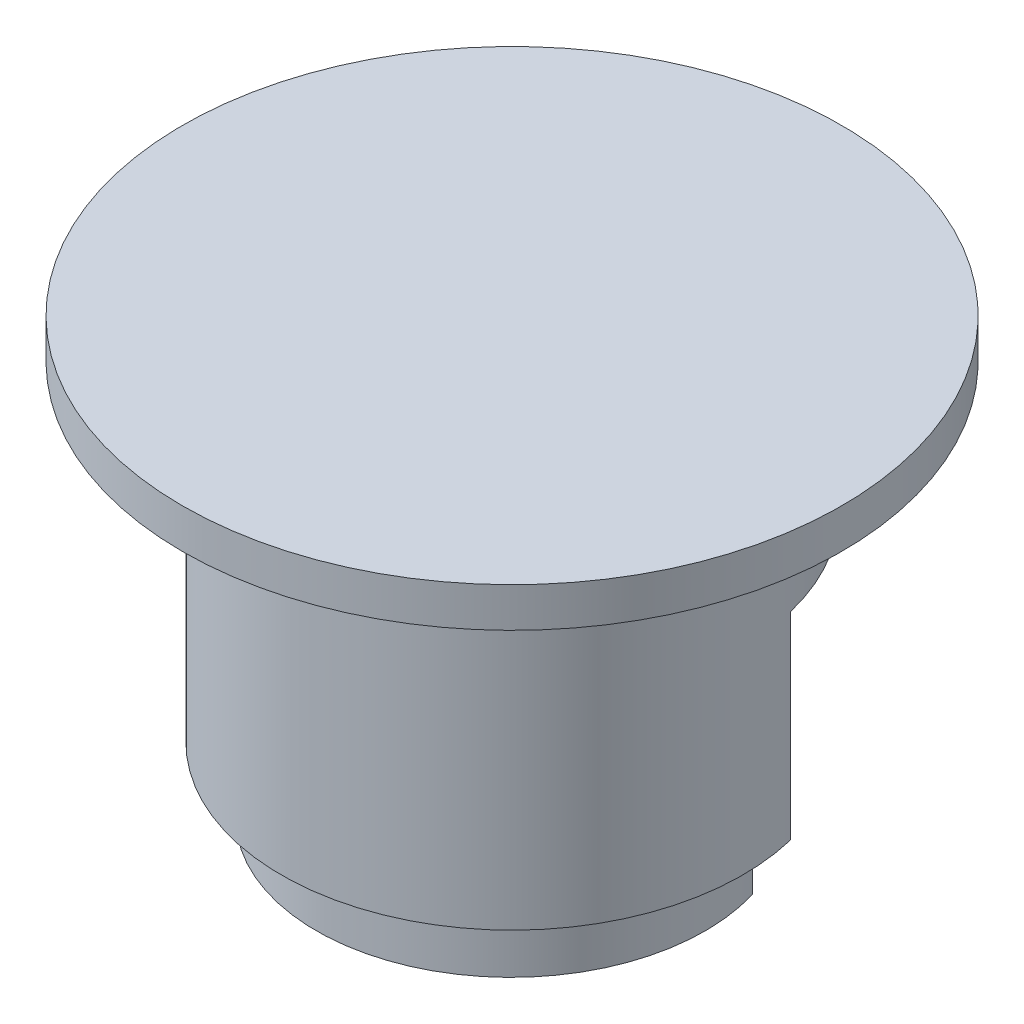
ISO-10303-21;
HEADER;
FILE_DESCRIPTION(('STEP AP214'),'2;1');
FILE_NAME('part.step','',(''),(''),'','','');
FILE_SCHEMA(('AUTOMOTIVE_DESIGN { 1 0 10303 214 1 1 1 1 }'));
ENDSEC;
DATA;
#1=APPLICATION_CONTEXT('core data for automotive mechanical design processes');
#2=APPLICATION_PROTOCOL_DEFINITION('international standard','automotive_design',2000,#1);
#3=PRODUCT_CONTEXT('',#1,'mechanical');
#4=PRODUCT('Part','Part','',(#3));
#5=PRODUCT_RELATED_PRODUCT_CATEGORY('part','',(#4));
#6=PRODUCT_DEFINITION_FORMATION('','',#4);
#7=PRODUCT_DEFINITION_CONTEXT('part definition',#1,'design');
#8=PRODUCT_DEFINITION('design','',#6,#7);
#9=PRODUCT_DEFINITION_SHAPE('','',#8);
#10=(LENGTH_UNIT() NAMED_UNIT(*) SI_UNIT(.MILLI.,.METRE.));
#11=(NAMED_UNIT(*) PLANE_ANGLE_UNIT() SI_UNIT($,.RADIAN.));
#12=(NAMED_UNIT(*) SI_UNIT($,.STERADIAN.) SOLID_ANGLE_UNIT());
#13=UNCERTAINTY_MEASURE_WITH_UNIT(LENGTH_MEASURE(1.E-05),#10,'distance_accuracy_value','');
#14=(GEOMETRIC_REPRESENTATION_CONTEXT(3) GLOBAL_UNCERTAINTY_ASSIGNED_CONTEXT((#13)) GLOBAL_UNIT_ASSIGNED_CONTEXT((#10,
#11,#12)) REPRESENTATION_CONTEXT('',''));
#15=CARTESIAN_POINT('',(0.,0.,0.));
#16=DIRECTION('',(0.,0.,1.));
#17=DIRECTION('',(1.,0.,0.));
#18=AXIS2_PLACEMENT_3D('',#15,#16,#17);
#19=CARTESIAN_POINT('',(0.,-60.,0.));
#20=DIRECTION('',(0.,-1.,0.));
#21=DIRECTION('',(0.,0.,-1.));
#22=AXIS2_PLACEMENT_3D('',#19,#20,#21);
#23=PLANE('',#22);
#24=DIRECTION('',(-1.,0.,0.));
#25=VECTOR('',#24,1.);
#26=CARTESIAN_POINT('',(0.,-60.,-8.20728450569601));
#27=LINE('',#26,#25);
#28=CARTESIAN_POINT('',(28.2813036881661,-60.,-8.20728450569601));
#29=VERTEX_POINT('',#28);
#30=CARTESIAN_POINT('',(6.,-60.,-8.20728450569601));
#31=VERTEX_POINT('',#30);
#32=EDGE_CURVE('E253',#29,#31,#27,.T.);
#33=ORIENTED_EDGE('',*,*,#32,.F.);
#34=CARTESIAN_POINT('',(0.,-60.,0.184250615944176));
#35=DIRECTION('',(0.,-1.,0.));
#36=DIRECTION('',(0.,0.,-1.));
#37=AXIS2_PLACEMENT_3D('',#34,#35,#36);
#38=CIRCLE('',#37,29.5);
#39=CARTESIAN_POINT('',(-28.2813036881661,-60.,-8.20728450569601));
#40=VERTEX_POINT('',#39);
#41=EDGE_CURVE('E189',#29,#40,#38,.T.);
#42=ORIENTED_EDGE('',*,*,#41,.T.);
#43=CARTESIAN_POINT('',(-6.,-60.,-8.20728450569601));
#44=VERTEX_POINT('',#43);
#45=EDGE_CURVE('E247',#44,#40,#27,.T.);
#46=ORIENTED_EDGE('',*,*,#45,.F.);
#47=DIRECTION('',(0.,0.,-1.));
#48=VECTOR('',#47,1.);
#49=CARTESIAN_POINT('',(-6.,-60.,0.));
#50=LINE('',#49,#48);
#51=CARTESIAN_POINT('',(-6.,-60.,-3.41877994011952));
#52=VERTEX_POINT('',#51);
#53=EDGE_CURVE('E232',#52,#44,#50,.T.);
#54=ORIENTED_EDGE('',*,*,#53,.F.);
#55=DIRECTION('',(-1.,0.,0.));
#56=VECTOR('',#55,1.);
#57=CARTESIAN_POINT('',(0.,-60.,-3.41877994011952));
#58=LINE('',#57,#56);
#59=CARTESIAN_POINT('',(-24.4594751937757,-60.,-3.41877994011952));
#60=VERTEX_POINT('',#59);
#61=EDGE_CURVE('E220',#52,#60,#58,.T.);
#62=ORIENTED_EDGE('',*,*,#61,.T.);
#63=CARTESIAN_POINT('',(-24.4594751937757,-60.,-1.41877994011952));
#64=DIRECTION('',(0.,-1.,0.));
#65=DIRECTION('',(0.,0.,-1.));
#66=AXIS2_PLACEMENT_3D('',#63,#64,#65);
#67=CIRCLE('',#66,2.);
#68=CARTESIAN_POINT('',(-26.2188474638346,-60.,-2.36988940561112));
#69=VERTEX_POINT('',#68);
#70=EDGE_CURVE('E315',#60,#69,#67,.F.);
#71=ORIENTED_EDGE('',*,*,#70,.T.);
#72=DIRECTION('',(-0.475554732745801,0.,0.87968613502946));
#73=VECTOR('',#72,1.);
#74=CARTESIAN_POINT('',(-21.2808116444844,-60.,-11.5043198832133));
#75=LINE('',#74,#73);
#76=CARTESIAN_POINT('',(-27.2545278621544,-60.,-0.454076936532669));
#77=VERTEX_POINT('',#76);
#78=EDGE_CURVE('E267',#69,#77,#75,.T.);
#79=ORIENTED_EDGE('',*,*,#78,.T.);
#80=CARTESIAN_POINT('',(-25.4951555920955,-60.,0.497032528958935));
#81=DIRECTION('',(0.,-1.,0.));
#82=DIRECTION('',(0.,0.,-1.));
#83=AXIS2_PLACEMENT_3D('',#80,#81,#82);
#84=CIRCLE('',#83,2.);
#85=CARTESIAN_POINT('',(-27.4947756385343,-60.,0.536015472406694));
#86=VERTEX_POINT('',#85);
#87=EDGE_CURVE('E317',#77,#86,#84,.F.);
#88=ORIENTED_EDGE('',*,*,#87,.T.);
#89=CARTESIAN_POINT('',(0.,-60.,0.));
#90=DIRECTION('',(0.,-1.,0.));
#91=DIRECTION('',(0.,0.,-1.));
#92=AXIS2_PLACEMENT_3D('',#89,#90,#91);
#93=CIRCLE('',#92,27.5);
#94=CARTESIAN_POINT('',(27.4963333127981,-60.,0.449059407551334));
#95=VERTEX_POINT('',#94);
#96=EDGE_CURVE('E264',#95,#86,#93,.T.);
#97=ORIENTED_EDGE('',*,*,#96,.F.);
#98=CARTESIAN_POINT('',(25.4965999809582,-60.,0.416400541547601));
#99=DIRECTION('',(0.,-1.,0.));
#100=DIRECTION('',(0.,0.,-1.));
#101=AXIS2_PLACEMENT_3D('',#98,#99,#100);
#102=CIRCLE('',#101,2.);
#103=CARTESIAN_POINT('',(27.3245113363701,-60.,-0.395227499340749));
#104=VERTEX_POINT('',#103);
#105=EDGE_CURVE('E12',#95,#104,#102,.F.);
#106=ORIENTED_EDGE('',*,*,#105,.T.);
#107=DIRECTION('',(-0.405814020444177,0.,-0.913955677705945));
#108=VECTOR('',#107,1.);
#109=CARTESIAN_POINT('',(22.9711619723007,-60.,-10.1996407721349));
#110=LINE('',#109,#108);
#111=CARTESIAN_POINT('',(26.5096556626515,-60.,-2.23040798100787));
#112=VERTEX_POINT('',#111);
#113=EDGE_CURVE('E265',#104,#112,#110,.T.);
#114=ORIENTED_EDGE('',*,*,#113,.T.);
#115=CARTESIAN_POINT('',(24.6817443072396,-60.,-1.41877994011952));
#116=DIRECTION('',(0.,-1.,0.));
#117=DIRECTION('',(0.,0.,-1.));
#118=AXIS2_PLACEMENT_3D('',#115,#116,#117);
#119=CIRCLE('',#118,2.);
#120=CARTESIAN_POINT('',(24.6817443072396,-60.,-3.41877994011952));
#121=VERTEX_POINT('',#120);
#122=EDGE_CURVE('E48',#112,#121,#119,.F.);
#123=ORIENTED_EDGE('',*,*,#122,.T.);
#124=CARTESIAN_POINT('',(6.,-60.,-3.41877994011952));
#125=VERTEX_POINT('',#124);
#126=EDGE_CURVE('E217',#121,#125,#58,.T.);
#127=ORIENTED_EDGE('',*,*,#126,.T.);
#128=DIRECTION('',(0.,0.,1.));
#129=VECTOR('',#128,1.);
#130=CARTESIAN_POINT('',(6.,-60.,0.));
#131=LINE('',#130,#129);
#132=EDGE_CURVE('E228',#31,#125,#131,.T.);
#133=ORIENTED_EDGE('',*,*,#132,.F.);
#134=EDGE_LOOP('',(#33,#42,#46,#54,#62,#71,#79,#88,#97,#106,#114,#123,#127,#133));
#135=FACE_BOUND('',#134,.T.);
#136=ADVANCED_FACE('F40',(#135),#23,.T.);
#137=CARTESIAN_POINT('',(-36.6947801670096,-20.0000000000001,-8.20728450569601));
#138=DIRECTION('',(0.,0.,1.));
#139=DIRECTION('',(1.,0.,0.));
#140=AXIS2_PLACEMENT_3D('',#137,#138,#139);
#141=PLANE('',#140);
#142=CARTESIAN_POINT('',(-21.25,-44.4403310049247,-8.20728450569601));
#143=DIRECTION('',(0.,0.,-1.));
#144=DIRECTION('',(-1.,0.,0.));
#145=AXIS2_PLACEMENT_3D('',#142,#143,#144);
#146=CIRCLE('',#145,1.1);
#147=CARTESIAN_POINT('',(-22.35,-44.4403310049247,-8.20728450569601));
#148=VERTEX_POINT('',#147);
#149=EDGE_CURVE('E461',#148,#148,#146,.T.);
#150=ORIENTED_EDGE('',*,*,#149,.F.);
#151=EDGE_LOOP('',(#150));
#152=FACE_BOUND('',#151,.T.);
#153=CARTESIAN_POINT('',(-21.25,-28.1403310049247,-8.20728450569601));
#154=DIRECTION('',(0.,0.,-1.));
#155=DIRECTION('',(-1.,0.,0.));
#156=AXIS2_PLACEMENT_3D('',#153,#154,#155);
#157=CIRCLE('',#156,1.09999999999999);
#158=CARTESIAN_POINT('',(-22.35,-28.1403310049247,-8.20728450569601));
#159=VERTEX_POINT('',#158);
#160=EDGE_CURVE('E281',#159,#159,#157,.T.);
#161=ORIENTED_EDGE('',*,*,#160,.F.);
#162=EDGE_LOOP('',(#161));
#163=FACE_BOUND('',#162,.T.);
#164=DIRECTION('',(1.,0.,0.));
#165=VECTOR('',#164,1.);
#166=CARTESIAN_POINT('',(-36.6947801670096,-50.,-8.20728450569601));
#167=LINE('',#166,#165);
#168=CARTESIAN_POINT('',(-34.0241161684262,-50.,-8.20728450569601));
#169=VERTEX_POINT('',#168);
#170=CARTESIAN_POINT('',(-28.2813036881661,-50.,-8.20728450569601));
#171=VERTEX_POINT('',#170);
#172=EDGE_CURVE('E200',#169,#171,#167,.T.);
#173=ORIENTED_EDGE('',*,*,#172,.F.);
#174=DIRECTION('',(0.,1.,0.));
#175=VECTOR('',#174,1.);
#176=CARTESIAN_POINT('',(-34.0241161684262,-60.,-8.20728450569601));
#177=LINE('',#176,#175);
#178=CARTESIAN_POINT('',(-34.0241161684262,-20.0000000000001,-8.20728450569601));
#179=VERTEX_POINT('',#178);
#180=EDGE_CURVE('E238',#179,#169,#177,.F.);
#181=ORIENTED_EDGE('',*,*,#180,.F.);
#182=DIRECTION('',(-1.,0.,0.));
#183=VECTOR('',#182,1.);
#184=CARTESIAN_POINT('',(-36.6947801670096,-20.0000000000001,-8.20728450569601));
#185=LINE('',#184,#183);
#186=CARTESIAN_POINT('',(-6.,-20.0000000000001,-8.20728450569601));
#187=VERTEX_POINT('',#186);
#188=EDGE_CURVE('E234',#187,#179,#185,.T.);
#189=ORIENTED_EDGE('',*,*,#188,.F.);
#190=DIRECTION('',(0.,-1.,0.));
#191=VECTOR('',#190,1.);
#192=CARTESIAN_POINT('',(-6.,-20.0000000000001,-8.20728450569601));
#193=LINE('',#192,#191);
#194=EDGE_CURVE('E258',#187,#44,#193,.T.);
#195=ORIENTED_EDGE('',*,*,#194,.T.);
#196=ORIENTED_EDGE('',*,*,#45,.T.);
#197=DIRECTION('',(0.,-1.,0.));
#198=VECTOR('',#197,1.);
#199=CARTESIAN_POINT('',(-28.2813036881661,-50.,-8.20728450569601));
#200=LINE('',#199,#198);
#201=EDGE_CURVE('E194',#171,#40,#200,.T.);
#202=ORIENTED_EDGE('',*,*,#201,.F.);
#203=EDGE_LOOP('',(#173,#181,#189,#195,#196,#202));
#204=FACE_BOUND('',#203,.T.);
#205=ADVANCED_FACE('F365',(#152,#163,#204),#141,.F.);
#206=CARTESIAN_POINT('',(0.,-60.,0.));
#207=DIRECTION('',(0.,1.,0.));
#208=DIRECTION('',(0.,0.,1.));
#209=AXIS2_PLACEMENT_3D('',#206,#207,#208);
#210=CYLINDRICAL_SURFACE('',#209,35.);
#211=CARTESIAN_POINT('',(0.,0.,0.));
#212=DIRECTION('',(0.,-1.,0.));
#213=DIRECTION('',(0.,0.,-1.));
#214=AXIS2_PLACEMENT_3D('',#211,#212,#213);
#215=CIRCLE('',#214,35.);
#216=CARTESIAN_POINT('',(0.,0.,-35.));
#217=VERTEX_POINT('',#216);
#218=EDGE_CURVE('E244',#217,#217,#215,.T.);
#219=ORIENTED_EDGE('',*,*,#218,.T.);
#220=EDGE_LOOP('',(#219));
#221=FACE_BOUND('',#220,.T.);
#222=CARTESIAN_POINT('',(0.,-50.,0.));
#223=DIRECTION('',(0.,-1.,0.));
#224=DIRECTION('',(0.,0.,-1.));
#225=AXIS2_PLACEMENT_3D('',#222,#223,#224);
#226=CIRCLE('',#225,35.);
#227=CARTESIAN_POINT('',(34.0241161684262,-50.,-8.20728450569601));
#228=VERTEX_POINT('',#227);
#229=EDGE_CURVE('E198',#228,#169,#226,.T.);
#230=ORIENTED_EDGE('',*,*,#229,.F.);
#231=DIRECTION('',(0.,1.,0.));
#232=VECTOR('',#231,1.);
#233=CARTESIAN_POINT('',(34.0241161684262,-60.,-8.20728450569601));
#234=LINE('',#233,#232);
#235=CARTESIAN_POINT('',(34.0241161684262,-20.0000000000001,-8.20728450569601));
#236=VERTEX_POINT('',#235);
#237=EDGE_CURVE('E241',#228,#236,#234,.T.);
#238=ORIENTED_EDGE('',*,*,#237,.T.);
#239=CARTESIAN_POINT('',(0.,-20.0000000000001,0.));
#240=DIRECTION('',(0.,-1.,0.));
#241=DIRECTION('',(0.,0.,-1.));
#242=AXIS2_PLACEMENT_3D('',#239,#240,#241);
#243=CIRCLE('',#242,35.);
#244=EDGE_CURVE('E255',#179,#236,#243,.T.);
#245=ORIENTED_EDGE('',*,*,#244,.F.);
#246=ORIENTED_EDGE('',*,*,#180,.T.);
#247=EDGE_LOOP('',(#230,#238,#245,#246));
#248=FACE_BOUND('',#247,.T.);
#249=ADVANCED_FACE('F388',(#221,#248),#210,.T.);
#250=CARTESIAN_POINT('',(21.25,-28.1403310049247,-8.20728450569601));
#251=DIRECTION('',(0.,0.,-1.));
#252=DIRECTION('',(-1.,0.,0.));
#253=AXIS2_PLACEMENT_3D('',#250,#251,#252);
#254=CIRCLE('',#253,1.09999999999999);
#255=CARTESIAN_POINT('',(20.15,-28.1403310049247,-8.20728450569601));
#256=VERTEX_POINT('',#255);
#257=EDGE_CURVE('E458',#256,#256,#254,.T.);
#258=ORIENTED_EDGE('',*,*,#257,.F.);
#259=EDGE_LOOP('',(#258));
#260=FACE_BOUND('',#259,.T.);
#261=CARTESIAN_POINT('',(21.25,-44.4403310049247,-8.20728450569601));
#262=DIRECTION('',(0.,0.,-1.));
#263=DIRECTION('',(-1.,0.,0.));
#264=AXIS2_PLACEMENT_3D('',#261,#262,#263);
#265=CIRCLE('',#264,1.1);
#266=CARTESIAN_POINT('',(20.15,-44.4403310049247,-8.20728450569601));
#267=VERTEX_POINT('',#266);
#268=EDGE_CURVE('E456',#267,#267,#265,.T.);
#269=ORIENTED_EDGE('',*,*,#268,.F.);
#270=EDGE_LOOP('',(#269));
#271=FACE_BOUND('',#270,.T.);
#272=DIRECTION('',(1.,0.,0.));
#273=VECTOR('',#272,1.);
#274=CARTESIAN_POINT('',(-36.6947801670096,-50.,-8.20728450569601));
#275=LINE('',#274,#273);
#276=CARTESIAN_POINT('',(28.2813036881661,-50.,-8.20728450569601));
#277=VERTEX_POINT('',#276);
#278=EDGE_CURVE('E274',#277,#228,#275,.T.);
#279=ORIENTED_EDGE('',*,*,#278,.F.);
#280=DIRECTION('',(0.,-1.,0.));
#281=VECTOR('',#280,1.);
#282=CARTESIAN_POINT('',(28.2813036881661,-50.,-8.20728450569601));
#283=LINE('',#282,#281);
#284=EDGE_CURVE('E270',#29,#277,#283,.F.);
#285=ORIENTED_EDGE('',*,*,#284,.F.);
#286=ORIENTED_EDGE('',*,*,#32,.T.);
#287=DIRECTION('',(0.,-1.,0.));
#288=VECTOR('',#287,1.);
#289=CARTESIAN_POINT('',(6.,-65.0000000000001,-8.20728450569601));
#290=LINE('',#289,#288);
#291=CARTESIAN_POINT('',(6.,-20.0000000000001,-8.20728450569601));
#292=VERTEX_POINT('',#291);
#293=EDGE_CURVE('E222',#292,#31,#290,.T.);
#294=ORIENTED_EDGE('',*,*,#293,.F.);
#295=EDGE_CURVE('E235',#236,#292,#185,.T.);
#296=ORIENTED_EDGE('',*,*,#295,.F.);
#297=ORIENTED_EDGE('',*,*,#237,.F.);
#298=EDGE_LOOP('',(#279,#285,#286,#294,#296,#297));
#299=FACE_BOUND('',#298,.T.);
#300=ADVANCED_FACE('F379',(#260,#271,#299),#141,.F.);
#301=CARTESIAN_POINT('',(0.,-20.0000000000001,0.));
#302=DIRECTION('',(0.,-1.,0.));
#303=DIRECTION('',(0.,0.,-1.));
#304=AXIS2_PLACEMENT_3D('',#301,#302,#303);
#305=PLANE('',#304);
#306=CARTESIAN_POINT('',(-0.384128463808236,-20.0000000000001,-0.397805506904507));
#307=DIRECTION('',(0.,-1.,0.));
#308=DIRECTION('',(0.,0.,-1.));
#309=AXIS2_PLACEMENT_3D('',#306,#307,#308);
#310=CIRCLE('',#309,31.0503714316237);
#311=CARTESIAN_POINT('',(-29.3841284638082,-20.0000000000001,-11.494001523639));
#312=VERTEX_POINT('',#311);
#313=CARTESIAN_POINT('',(28.6158715361918,-20.0000000000001,-11.494001523639));
#314=VERTEX_POINT('',#313);
#315=EDGE_CURVE('E170',#312,#314,#310,.T.);
#316=ORIENTED_EDGE('',*,*,#315,.F.);
#317=DIRECTION('',(-1.,0.,0.));
#318=VECTOR('',#317,1.);
#319=CARTESIAN_POINT('',(-29.3841284638082,-20.0000000000001,-11.494001523639));
#320=LINE('',#319,#318);
#321=EDGE_CURVE('E180',#314,#312,#320,.T.);
#322=ORIENTED_EDGE('',*,*,#321,.F.);
#323=EDGE_LOOP('',(#316,#322));
#324=FACE_BOUND('',#323,.T.);
#325=DIRECTION('',(0.,0.,-1.));
#326=VECTOR('',#325,1.);
#327=CARTESIAN_POINT('',(6.,-20.0000000000001,21.792715494304));
#328=LINE('',#327,#326);
#329=CARTESIAN_POINT('',(6.,-20.0000000000001,-3.41877994011952));
#330=VERTEX_POINT('',#329);
#331=EDGE_CURVE('E226',#330,#292,#328,.T.);
#332=ORIENTED_EDGE('',*,*,#331,.F.);
#333=DIRECTION('',(-1.,0.,0.));
#334=VECTOR('',#333,1.);
#335=CARTESIAN_POINT('',(0.,-20.0000000000001,-3.41877994011952));
#336=LINE('',#335,#334);
#337=CARTESIAN_POINT('',(-6.,-20.0000000000001,-3.41877994011952));
#338=VERTEX_POINT('',#337);
#339=EDGE_CURVE('E214',#330,#338,#336,.T.);
#340=ORIENTED_EDGE('',*,*,#339,.T.);
#341=DIRECTION('',(0.,0.,-1.));
#342=VECTOR('',#341,1.);
#343=CARTESIAN_POINT('',(-6.,-20.0000000000001,21.792715494304));
#344=LINE('',#343,#342);
#345=EDGE_CURVE('E225',#338,#187,#344,.T.);
#346=ORIENTED_EDGE('',*,*,#345,.T.);
#347=ORIENTED_EDGE('',*,*,#188,.T.);
#348=ORIENTED_EDGE('',*,*,#244,.T.);
#349=ORIENTED_EDGE('',*,*,#295,.T.);
#350=EDGE_LOOP('',(#332,#340,#346,#347,#348,#349));
#351=FACE_BOUND('',#350,.T.);
#352=ADVANCED_FACE('F371',(#324,#351),#305,.T.);
#353=CARTESIAN_POINT('',(-6.,-65.0000000000001,21.792715494304));
#354=DIRECTION('',(-1.,0.,0.));
#355=DIRECTION('',(0.,0.,1.));
#356=AXIS2_PLACEMENT_3D('',#353,#354,#355);
#357=PLANE('',#356);
#358=DIRECTION('',(0.,1.,0.));
#359=VECTOR('',#358,1.);
#360=CARTESIAN_POINT('',(-6.,-65.0000000000001,-3.41877994011952));
#361=LINE('',#360,#359);
#362=EDGE_CURVE('E219',#52,#338,#361,.T.);
#363=ORIENTED_EDGE('',*,*,#362,.F.);
#364=ORIENTED_EDGE('',*,*,#53,.T.);
#365=ORIENTED_EDGE('',*,*,#194,.F.);
#366=ORIENTED_EDGE('',*,*,#345,.F.);
#367=EDGE_LOOP('',(#363,#364,#365,#366));
#368=FACE_BOUND('',#367,.T.);
#369=ADVANCED_FACE('F360',(#368),#357,.F.);
#370=CARTESIAN_POINT('',(6.,-65.0000000000001,21.792715494304));
#371=DIRECTION('',(1.,0.,0.));
#372=DIRECTION('',(0.,0.,-1.));
#373=AXIS2_PLACEMENT_3D('',#370,#371,#372);
#374=PLANE('',#373);
#375=DIRECTION('',(0.,-1.,0.));
#376=VECTOR('',#375,1.);
#377=CARTESIAN_POINT('',(6.,-65.0000000000001,-3.41877994011952));
#378=LINE('',#377,#376);
#379=EDGE_CURVE('E261',#330,#125,#378,.T.);
#380=ORIENTED_EDGE('',*,*,#379,.F.);
#381=ORIENTED_EDGE('',*,*,#331,.T.);
#382=ORIENTED_EDGE('',*,*,#293,.T.);
#383=ORIENTED_EDGE('',*,*,#132,.T.);
#384=EDGE_LOOP('',(#380,#381,#382,#383));
#385=FACE_BOUND('',#384,.T.);
#386=ADVANCED_FACE('F374',(#385),#374,.F.);
#387=CARTESIAN_POINT('',(0.,6.,0.));
#388=DIRECTION('',(0.,-1.,0.));
#389=DIRECTION('',(0.,0.,-1.));
#390=AXIS2_PLACEMENT_3D('',#387,#388,#389);
#391=CYLINDRICAL_SURFACE('',#390,50.);
#392=CARTESIAN_POINT('',(0.,6.,0.));
#393=DIRECTION('',(0.,1.,0.));
#394=DIRECTION('',(0.,0.,1.));
#395=AXIS2_PLACEMENT_3D('',#392,#393,#394);
#396=CIRCLE('',#395,50.);
#397=CARTESIAN_POINT('',(0.,6.,50.));
#398=VERTEX_POINT('',#397);
#399=EDGE_CURVE('E248',#398,#398,#396,.T.);
#400=ORIENTED_EDGE('',*,*,#399,.F.);
#401=EDGE_LOOP('',(#400));
#402=FACE_BOUND('',#401,.T.);
#403=CARTESIAN_POINT('',(0.,0.,0.));
#404=DIRECTION('',(0.,1.,0.));
#405=DIRECTION('',(0.,0.,1.));
#406=AXIS2_PLACEMENT_3D('',#403,#404,#405);
#407=CIRCLE('',#406,50.);
#408=CARTESIAN_POINT('',(0.,0.,50.));
#409=VERTEX_POINT('',#408);
#410=EDGE_CURVE('E243',#409,#409,#407,.T.);
#411=ORIENTED_EDGE('',*,*,#410,.T.);
#412=EDGE_LOOP('',(#411));
#413=FACE_BOUND('',#412,.T.);
#414=ADVANCED_FACE('F415',(#402,#413),#391,.T.);
#415=CARTESIAN_POINT('',(0.,6.,0.));
#416=DIRECTION('',(0.,1.,0.));
#417=DIRECTION('',(0.,0.,1.));
#418=AXIS2_PLACEMENT_3D('',#415,#416,#417);
#419=PLANE('',#418);
#420=ORIENTED_EDGE('',*,*,#399,.T.);
#421=EDGE_LOOP('',(#420));
#422=FACE_BOUND('',#421,.T.);
#423=ADVANCED_FACE('F525',(#422),#419,.T.);
#424=CARTESIAN_POINT('',(0.,0.,0.));
#425=DIRECTION('',(0.,1.,0.));
#426=DIRECTION('',(0.,0.,1.));
#427=AXIS2_PLACEMENT_3D('',#424,#425,#426);
#428=PLANE('',#427);
#429=ORIENTED_EDGE('',*,*,#218,.F.);
#430=EDGE_LOOP('',(#429));
#431=FACE_BOUND('',#430,.T.);
#432=ORIENTED_EDGE('',*,*,#410,.F.);
#433=EDGE_LOOP('',(#432));
#434=FACE_BOUND('',#433,.T.);
#435=ADVANCED_FACE('F417',(#431,#434),#428,.F.);
#436=CARTESIAN_POINT('',(-27.5,-60.000012,0.));
#437=DIRECTION('',(0.87968613502946,0.,0.475554732745801));
#438=DIRECTION('',(0.475554732745801,0.,-0.87968613502946));
#439=AXIS2_PLACEMENT_3D('',#436,#437,#438);
#440=PLANE('',#439);
#441=ORIENTED_EDGE('',*,*,#78,.F.);
#442=DIRECTION('',(0.,1.,0.));
#443=VECTOR('',#442,1.);
#444=CARTESIAN_POINT('',(-26.2188474638346,0.,-2.36988940561112));
#445=LINE('',#444,#443);
#446=CARTESIAN_POINT('',(-26.2188474638346,0.,-2.36988940561112));
#447=VERTEX_POINT('',#446);
#448=EDGE_CURVE('E291',#69,#447,#445,.T.);
#449=ORIENTED_EDGE('',*,*,#448,.T.);
#450=DIRECTION('',(0.475554732745801,0.,-0.87968613502946));
#451=VECTOR('',#450,1.);
#452=CARTESIAN_POINT('',(-27.5,0.,0.));
#453=LINE('',#452,#451);
#454=CARTESIAN_POINT('',(-27.2545278621544,0.,-0.45407693653267));
#455=VERTEX_POINT('',#454);
#456=EDGE_CURVE('E205',#455,#447,#453,.T.);
#457=ORIENTED_EDGE('',*,*,#456,.F.);
#458=DIRECTION('',(0.,-1.,0.));
#459=VECTOR('',#458,1.);
#460=CARTESIAN_POINT('',(-27.2545278621544,-60.000012,-0.454076936532669));
#461=LINE('',#460,#459);
#462=EDGE_CURVE('E276',#455,#77,#461,.T.);
#463=ORIENTED_EDGE('',*,*,#462,.T.);
#464=EDGE_LOOP('',(#441,#449,#457,#463));
#465=FACE_BOUND('',#464,.T.);
#466=ADVANCED_FACE('F347',(#465),#440,.T.);
#467=CARTESIAN_POINT('',(-25.6518215236099,-60.000012,-3.41877994011952));
#468=DIRECTION('',(0.,0.,1.));
#469=DIRECTION('',(1.,0.,0.));
#470=AXIS2_PLACEMENT_3D('',#467,#468,#469);
#471=PLANE('',#470);
#472=CARTESIAN_POINT('',(-21.25,-44.4403310049247,-3.41877994011952));
#473=DIRECTION('',(0.,0.,1.));
#474=DIRECTION('',(1.,0.,0.));
#475=AXIS2_PLACEMENT_3D('',#472,#473,#474);
#476=CIRCLE('',#475,1.1);
#477=CARTESIAN_POINT('',(-20.15,-44.4403310049247,-3.41877994011952));
#478=VERTEX_POINT('',#477);
#479=EDGE_CURVE('E187',#478,#478,#476,.T.);
#480=ORIENTED_EDGE('',*,*,#479,.F.);
#481=EDGE_LOOP('',(#480));
#482=FACE_BOUND('',#481,.T.);
#483=CARTESIAN_POINT('',(21.25,-28.1403310049247,-3.41877994011952));
#484=DIRECTION('',(0.,0.,1.));
#485=DIRECTION('',(1.,0.,0.));
#486=AXIS2_PLACEMENT_3D('',#483,#484,#485);
#487=CIRCLE('',#486,1.09999999999999);
#488=CARTESIAN_POINT('',(22.35,-28.1403310049247,-3.41877994011952));
#489=VERTEX_POINT('',#488);
#490=EDGE_CURVE('E284',#489,#489,#487,.T.);
#491=ORIENTED_EDGE('',*,*,#490,.F.);
#492=EDGE_LOOP('',(#491));
#493=FACE_BOUND('',#492,.T.);
#494=CARTESIAN_POINT('',(21.25,-44.4403310049247,-3.41877994011952));
#495=DIRECTION('',(0.,0.,1.));
#496=DIRECTION('',(1.,0.,0.));
#497=AXIS2_PLACEMENT_3D('',#494,#495,#496);
#498=CIRCLE('',#497,1.1);
#499=CARTESIAN_POINT('',(22.35,-44.4403310049247,-3.41877994011952));
#500=VERTEX_POINT('',#499);
#501=EDGE_CURVE('E280',#500,#500,#498,.T.);
#502=ORIENTED_EDGE('',*,*,#501,.F.);
#503=EDGE_LOOP('',(#502));
#504=FACE_BOUND('',#503,.T.);
#505=CARTESIAN_POINT('',(-21.25,-28.1403310049247,-3.41877994011952));
#506=DIRECTION('',(0.,0.,1.));
#507=DIRECTION('',(1.,0.,0.));
#508=AXIS2_PLACEMENT_3D('',#505,#506,#507);
#509=CIRCLE('',#508,1.09999999999999);
#510=CARTESIAN_POINT('',(-20.15,-28.1403310049247,-3.41877994011952));
#511=VERTEX_POINT('',#510);
#512=EDGE_CURVE('E277',#511,#511,#509,.T.);
#513=ORIENTED_EDGE('',*,*,#512,.F.);
#514=EDGE_LOOP('',(#513));
#515=FACE_BOUND('',#514,.T.);
#516=DIRECTION('',(1.,0.,0.));
#517=VECTOR('',#516,1.);
#518=CARTESIAN_POINT('',(-25.6518215236099,0.,-3.41877994011952));
#519=LINE('',#518,#517);
#520=CARTESIAN_POINT('',(-24.4594751937757,0.,-3.41877994011952));
#521=VERTEX_POINT('',#520);
#522=CARTESIAN_POINT('',(24.6817443072396,0.,-3.41877994011952));
#523=VERTEX_POINT('',#522);
#524=EDGE_CURVE('E208',#521,#523,#519,.T.);
#525=ORIENTED_EDGE('',*,*,#524,.F.);
#526=DIRECTION('',(0.,1.,0.));
#527=VECTOR('',#526,1.);
#528=CARTESIAN_POINT('',(-24.4594751937757,-60.,-3.41877994011952));
#529=LINE('',#528,#527);
#530=EDGE_CURVE('E305',#521,#60,#529,.F.);
#531=ORIENTED_EDGE('',*,*,#530,.T.);
#532=ORIENTED_EDGE('',*,*,#61,.F.);
#533=ORIENTED_EDGE('',*,*,#362,.T.);
#534=ORIENTED_EDGE('',*,*,#339,.F.);
#535=ORIENTED_EDGE('',*,*,#379,.T.);
#536=ORIENTED_EDGE('',*,*,#126,.F.);
#537=DIRECTION('',(0.,1.,0.));
#538=VECTOR('',#537,1.);
#539=CARTESIAN_POINT('',(24.6817443072396,0.,-3.41877994011952));
#540=LINE('',#539,#538);
#541=EDGE_CURVE('E302',#121,#523,#540,.T.);
#542=ORIENTED_EDGE('',*,*,#541,.T.);
#543=EDGE_LOOP('',(#525,#531,#532,#533,#534,#535,#536,#542));
#544=FACE_BOUND('',#543,.T.);
#545=ADVANCED_FACE('F326',(#482,#493,#504,#515,#544),#471,.T.);
#546=CARTESIAN_POINT('',(27.5,-60.000012,0.));
#547=DIRECTION('',(-0.913955677705945,0.,0.405814020444177));
#548=DIRECTION('',(0.405814020444177,0.,0.913955677705945));
#549=AXIS2_PLACEMENT_3D('',#546,#547,#548);
#550=PLANE('',#549);
#551=DIRECTION('',(0.405814020444177,0.,0.913955677705945));
#552=VECTOR('',#551,1.);
#553=CARTESIAN_POINT('',(27.5,0.,0.));
#554=LINE('',#553,#552);
#555=CARTESIAN_POINT('',(26.5096556626515,0.,-2.23040798100787));
#556=VERTEX_POINT('',#555);
#557=CARTESIAN_POINT('',(27.3245113363701,0.,-0.395227499340751));
#558=VERTEX_POINT('',#557);
#559=EDGE_CURVE('E211',#556,#558,#554,.T.);
#560=ORIENTED_EDGE('',*,*,#559,.F.);
#561=DIRECTION('',(0.,1.,0.));
#562=VECTOR('',#561,1.);
#563=CARTESIAN_POINT('',(26.5096556626515,-60.,-2.23040798100788));
#564=LINE('',#563,#562);
#565=EDGE_CURVE('E55',#556,#112,#564,.F.);
#566=ORIENTED_EDGE('',*,*,#565,.T.);
#567=ORIENTED_EDGE('',*,*,#113,.F.);
#568=DIRECTION('',(0.,-1.,0.));
#569=VECTOR('',#568,1.);
#570=CARTESIAN_POINT('',(27.3245113363701,-60.000012,-0.395227499340751));
#571=LINE('',#570,#569);
#572=EDGE_CURVE('E312',#104,#558,#571,.F.);
#573=ORIENTED_EDGE('',*,*,#572,.T.);
#574=EDGE_LOOP('',(#560,#566,#567,#573));
#575=FACE_BOUND('',#574,.T.);
#576=ADVANCED_FACE('F332',(#575),#550,.T.);
#577=CARTESIAN_POINT('',(0.,0.,0.));
#578=DIRECTION('',(0.,-1.,0.));
#579=DIRECTION('',(0.,0.,-1.));
#580=AXIS2_PLACEMENT_3D('',#577,#578,#579);
#581=CYLINDRICAL_SURFACE('',#580,27.5);
#582=ORIENTED_EDGE('',*,*,#96,.T.);
#583=DIRECTION('',(0.,-1.,0.));
#584=VECTOR('',#583,1.);
#585=CARTESIAN_POINT('',(-27.4947756385343,0.,0.536015472406695));
#586=LINE('',#585,#584);
#587=CARTESIAN_POINT('',(-27.4947756385343,0.,0.536015472406694));
#588=VERTEX_POINT('',#587);
#589=EDGE_CURVE('E310',#86,#588,#586,.F.);
#590=ORIENTED_EDGE('',*,*,#589,.T.);
#591=CARTESIAN_POINT('',(0.,0.,0.));
#592=DIRECTION('',(0.,-1.,0.));
#593=DIRECTION('',(0.,0.,1.));
#594=AXIS2_PLACEMENT_3D('',#591,#592,#593);
#595=CIRCLE('',#594,27.5);
#596=CARTESIAN_POINT('',(27.4963333127981,0.,0.449059407551334));
#597=VERTEX_POINT('',#596);
#598=EDGE_CURVE('E202',#597,#588,#595,.T.);
#599=ORIENTED_EDGE('',*,*,#598,.F.);
#600=DIRECTION('',(0.,-1.,0.));
#601=VECTOR('',#600,1.);
#602=CARTESIAN_POINT('',(27.4963333127981,0.,0.449059407551334));
#603=LINE('',#602,#601);
#604=EDGE_CURVE('E307',#597,#95,#603,.T.);
#605=ORIENTED_EDGE('',*,*,#604,.T.);
#606=EDGE_LOOP('',(#582,#590,#599,#605));
#607=FACE_BOUND('',#606,.T.);
#608=ADVANCED_FACE('F339',(#607),#581,.F.);
#609=CARTESIAN_POINT('',(0.,0.,0.));
#610=DIRECTION('',(0.,1.,0.));
#611=DIRECTION('',(0.,0.,1.));
#612=AXIS2_PLACEMENT_3D('',#609,#610,#611);
#613=PLANE('',#612);
#614=ORIENTED_EDGE('',*,*,#456,.T.);
#615=CARTESIAN_POINT('',(-24.4594751937757,0.,-1.41877994011952));
#616=DIRECTION('',(0.,1.,0.));
#617=DIRECTION('',(0.,0.,1.));
#618=AXIS2_PLACEMENT_3D('',#615,#616,#617);
#619=CIRCLE('',#618,2.);
#620=EDGE_CURVE('E300',#447,#521,#619,.F.);
#621=ORIENTED_EDGE('',*,*,#620,.T.);
#622=ORIENTED_EDGE('',*,*,#524,.T.);
#623=CARTESIAN_POINT('',(24.6817443072396,0.,-1.41877994011952));
#624=DIRECTION('',(0.,1.,0.));
#625=DIRECTION('',(0.,0.,1.));
#626=AXIS2_PLACEMENT_3D('',#623,#624,#625);
#627=CIRCLE('',#626,2.);
#628=EDGE_CURVE('E296',#523,#556,#627,.F.);
#629=ORIENTED_EDGE('',*,*,#628,.T.);
#630=ORIENTED_EDGE('',*,*,#559,.T.);
#631=CARTESIAN_POINT('',(25.4965999809582,0.,0.416400541547601));
#632=DIRECTION('',(0.,1.,0.));
#633=DIRECTION('',(0.,0.,1.));
#634=AXIS2_PLACEMENT_3D('',#631,#632,#633);
#635=CIRCLE('',#634,2.);
#636=EDGE_CURVE('E294',#558,#597,#635,.F.);
#637=ORIENTED_EDGE('',*,*,#636,.T.);
#638=ORIENTED_EDGE('',*,*,#598,.T.);
#639=CARTESIAN_POINT('',(-25.4951555920955,0.,0.497032528958935));
#640=DIRECTION('',(0.,1.,0.));
#641=DIRECTION('',(0.,0.,1.));
#642=AXIS2_PLACEMENT_3D('',#639,#640,#641);
#643=CIRCLE('',#642,2.);
#644=EDGE_CURVE('E298',#588,#455,#643,.F.);
#645=ORIENTED_EDGE('',*,*,#644,.T.);
#646=EDGE_LOOP('',(#614,#621,#622,#629,#630,#637,#638,#645));
#647=FACE_BOUND('',#646,.T.);
#648=ADVANCED_FACE('F330',(#647),#613,.F.);
#649=CARTESIAN_POINT('',(0.,-50.,0.));
#650=DIRECTION('',(0.,-1.,0.));
#651=DIRECTION('',(0.,0.,-1.));
#652=AXIS2_PLACEMENT_3D('',#649,#650,#651);
#653=PLANE('',#652);
#654=ORIENTED_EDGE('',*,*,#172,.T.);
#655=CARTESIAN_POINT('',(0.,-50.,0.184250615944176));
#656=DIRECTION('',(0.,-1.,0.));
#657=DIRECTION('',(0.,0.,-1.));
#658=AXIS2_PLACEMENT_3D('',#655,#656,#657);
#659=CIRCLE('',#658,29.5);
#660=EDGE_CURVE('E191',#277,#171,#659,.T.);
#661=ORIENTED_EDGE('',*,*,#660,.F.);
#662=ORIENTED_EDGE('',*,*,#278,.T.);
#663=ORIENTED_EDGE('',*,*,#229,.T.);
#664=EDGE_LOOP('',(#654,#661,#662,#663));
#665=FACE_BOUND('',#664,.T.);
#666=ADVANCED_FACE('F385',(#665),#653,.T.);
#667=CARTESIAN_POINT('',(0.,-50.,0.184250615944176));
#668=DIRECTION('',(0.,-1.,0.));
#669=DIRECTION('',(0.,0.,-1.));
#670=AXIS2_PLACEMENT_3D('',#667,#668,#669);
#671=CYLINDRICAL_SURFACE('',#670,29.5);
#672=ORIENTED_EDGE('',*,*,#201,.T.);
#673=ORIENTED_EDGE('',*,*,#41,.F.);
#674=ORIENTED_EDGE('',*,*,#284,.T.);
#675=ORIENTED_EDGE('',*,*,#660,.T.);
#676=EDGE_LOOP('',(#672,#673,#674,#675));
#677=FACE_BOUND('',#676,.T.);
#678=ADVANCED_FACE('F383',(#677),#671,.T.);
#679=CARTESIAN_POINT('',(-0.384128463808236,0.,-0.397805506904507));
#680=DIRECTION('',(0.,-1.,0.));
#681=DIRECTION('',(0.,0.,-1.));
#682=AXIS2_PLACEMENT_3D('',#679,#680,#681);
#683=CYLINDRICAL_SURFACE('',#682,31.0503714316237);
#684=ORIENTED_EDGE('',*,*,#315,.T.);
#685=DIRECTION('',(0.,-1.,0.));
#686=VECTOR('',#685,1.);
#687=CARTESIAN_POINT('',(28.6158715361918,0.,-11.494001523639));
#688=LINE('',#687,#686);
#689=CARTESIAN_POINT('',(28.6158715361918,0.,-11.494001523639));
#690=VERTEX_POINT('',#689);
#691=EDGE_CURVE('E164',#690,#314,#688,.T.);
#692=ORIENTED_EDGE('',*,*,#691,.F.);
#693=CARTESIAN_POINT('',(-0.384128463808236,0.,-0.397805506904507));
#694=DIRECTION('',(0.,-1.,0.));
#695=DIRECTION('',(0.,0.,-1.));
#696=AXIS2_PLACEMENT_3D('',#693,#694,#695);
#697=CIRCLE('',#696,31.0503714316237);
#698=CARTESIAN_POINT('',(-29.3841284638082,0.,-11.494001523639));
#699=VERTEX_POINT('',#698);
#700=EDGE_CURVE('E167',#699,#690,#697,.T.);
#701=ORIENTED_EDGE('',*,*,#700,.F.);
#702=DIRECTION('',(0.,-1.,0.));
#703=VECTOR('',#702,1.);
#704=CARTESIAN_POINT('',(-29.3841284638082,0.,-11.494001523639));
#705=LINE('',#704,#703);
#706=EDGE_CURVE('E175',#699,#312,#705,.T.);
#707=ORIENTED_EDGE('',*,*,#706,.T.);
#708=EDGE_LOOP('',(#684,#692,#701,#707));
#709=FACE_BOUND('',#708,.T.);
#710=ADVANCED_FACE('F166',(#709),#683,.F.);
#711=CARTESIAN_POINT('',(-29.3841284638082,0.,-11.494001523639));
#712=DIRECTION('',(0.,0.,1.));
#713=DIRECTION('',(1.,0.,0.));
#714=AXIS2_PLACEMENT_3D('',#711,#712,#713);
#715=PLANE('',#714);
#716=ORIENTED_EDGE('',*,*,#321,.T.);
#717=ORIENTED_EDGE('',*,*,#706,.F.);
#718=DIRECTION('',(-1.,0.,0.));
#719=VECTOR('',#718,1.);
#720=CARTESIAN_POINT('',(-29.3841284638082,0.,-11.494001523639));
#721=LINE('',#720,#719);
#722=EDGE_CURVE('E176',#690,#699,#721,.T.);
#723=ORIENTED_EDGE('',*,*,#722,.F.);
#724=ORIENTED_EDGE('',*,*,#691,.T.);
#725=EDGE_LOOP('',(#716,#717,#723,#724));
#726=FACE_BOUND('',#725,.T.);
#727=ADVANCED_FACE('F182',(#726),#715,.F.);
#728=CARTESIAN_POINT('',(-0.384128463808236,0.,-0.397805506904507));
#729=DIRECTION('',(0.,-1.,0.));
#730=DIRECTION('',(0.,0.,-1.));
#731=AXIS2_PLACEMENT_3D('',#728,#729,#730);
#732=PLANE('',#731);
#733=ORIENTED_EDGE('',*,*,#700,.T.);
#734=ORIENTED_EDGE('',*,*,#722,.T.);
#735=EDGE_LOOP('',(#733,#734));
#736=FACE_BOUND('',#735,.T.);
#737=ADVANCED_FACE('F179',(#736),#732,.T.);
#738=CARTESIAN_POINT('',(-21.25,-28.1403310049247,1.79271549430399));
#739=DIRECTION('',(0.,0.,-1.));
#740=DIRECTION('',(-1.,0.,0.));
#741=AXIS2_PLACEMENT_3D('',#738,#739,#740);
#742=CYLINDRICAL_SURFACE('',#741,1.09999999999999);
#743=ORIENTED_EDGE('',*,*,#512,.T.);
#744=EDGE_LOOP('',(#743));
#745=FACE_BOUND('',#744,.T.);
#746=ORIENTED_EDGE('',*,*,#160,.T.);
#747=EDGE_LOOP('',(#746));
#748=FACE_BOUND('',#747,.T.);
#749=ADVANCED_FACE('F436',(#745,#748),#742,.F.);
#750=CARTESIAN_POINT('',(21.25,-44.4403310049247,1.79271549430399));
#751=DIRECTION('',(0.,0.,-1.));
#752=DIRECTION('',(-1.,0.,0.));
#753=AXIS2_PLACEMENT_3D('',#750,#751,#752);
#754=CYLINDRICAL_SURFACE('',#753,1.1);
#755=ORIENTED_EDGE('',*,*,#501,.T.);
#756=EDGE_LOOP('',(#755));
#757=FACE_BOUND('',#756,.T.);
#758=ORIENTED_EDGE('',*,*,#268,.T.);
#759=EDGE_LOOP('',(#758));
#760=FACE_BOUND('',#759,.T.);
#761=ADVANCED_FACE('F439',(#757,#760),#754,.F.);
#762=CARTESIAN_POINT('',(21.25,-28.1403310049247,1.79271549430399));
#763=DIRECTION('',(0.,0.,-1.));
#764=DIRECTION('',(-1.,0.,0.));
#765=AXIS2_PLACEMENT_3D('',#762,#763,#764);
#766=CYLINDRICAL_SURFACE('',#765,1.09999999999999);
#767=ORIENTED_EDGE('',*,*,#490,.T.);
#768=EDGE_LOOP('',(#767));
#769=FACE_BOUND('',#768,.T.);
#770=ORIENTED_EDGE('',*,*,#257,.T.);
#771=EDGE_LOOP('',(#770));
#772=FACE_BOUND('',#771,.T.);
#773=ADVANCED_FACE('F441',(#769,#772),#766,.F.);
#774=CARTESIAN_POINT('',(-21.25,-44.4403310049247,1.79271549430399));
#775=DIRECTION('',(0.,0.,-1.));
#776=DIRECTION('',(-1.,0.,0.));
#777=AXIS2_PLACEMENT_3D('',#774,#775,#776);
#778=CYLINDRICAL_SURFACE('',#777,1.1);
#779=ORIENTED_EDGE('',*,*,#479,.T.);
#780=EDGE_LOOP('',(#779));
#781=FACE_BOUND('',#780,.T.);
#782=ORIENTED_EDGE('',*,*,#149,.T.);
#783=EDGE_LOOP('',(#782));
#784=FACE_BOUND('',#783,.T.);
#785=ADVANCED_FACE('F444',(#781,#784),#778,.F.);
#786=CARTESIAN_POINT('',(-24.4594751937757,-60.000012,-1.41877994011952));
#787=DIRECTION('',(0.,-1.,0.));
#788=DIRECTION('',(0.,0.,-1.));
#789=AXIS2_PLACEMENT_3D('',#786,#787,#788);
#790=CYLINDRICAL_SURFACE('',#789,2.);
#791=ORIENTED_EDGE('',*,*,#70,.F.);
#792=ORIENTED_EDGE('',*,*,#530,.F.);
#793=ORIENTED_EDGE('',*,*,#620,.F.);
#794=ORIENTED_EDGE('',*,*,#448,.F.);
#795=EDGE_LOOP('',(#791,#792,#793,#794));
#796=FACE_BOUND('',#795,.T.);
#797=ADVANCED_FACE('F351',(#796),#790,.F.);
#798=CARTESIAN_POINT('',(-25.4951555920955,0.,0.497032528958935));
#799=DIRECTION('',(0.,-1.,0.));
#800=DIRECTION('',(0.,0.,-1.));
#801=AXIS2_PLACEMENT_3D('',#798,#799,#800);
#802=CYLINDRICAL_SURFACE('',#801,2.);
#803=ORIENTED_EDGE('',*,*,#644,.F.);
#804=ORIENTED_EDGE('',*,*,#589,.F.);
#805=ORIENTED_EDGE('',*,*,#87,.F.);
#806=ORIENTED_EDGE('',*,*,#462,.F.);
#807=EDGE_LOOP('',(#803,#804,#805,#806));
#808=FACE_BOUND('',#807,.T.);
#809=ADVANCED_FACE('F342',(#808),#802,.F.);
#810=CARTESIAN_POINT('',(24.6817443072396,-60.000012,-1.41877994011952));
#811=DIRECTION('',(0.,-1.,0.));
#812=DIRECTION('',(0.,0.,-1.));
#813=AXIS2_PLACEMENT_3D('',#810,#811,#812);
#814=CYLINDRICAL_SURFACE('',#813,2.);
#815=ORIENTED_EDGE('',*,*,#122,.F.);
#816=ORIENTED_EDGE('',*,*,#565,.F.);
#817=ORIENTED_EDGE('',*,*,#628,.F.);
#818=ORIENTED_EDGE('',*,*,#541,.F.);
#819=EDGE_LOOP('',(#815,#816,#817,#818));
#820=FACE_BOUND('',#819,.T.);
#821=ADVANCED_FACE('F328',(#820),#814,.F.);
#822=CARTESIAN_POINT('',(25.4965999809582,0.,0.416400541547601));
#823=DIRECTION('',(0.,-1.,0.));
#824=DIRECTION('',(0.,0.,-1.));
#825=AXIS2_PLACEMENT_3D('',#822,#823,#824);
#826=CYLINDRICAL_SURFACE('',#825,2.);
#827=ORIENTED_EDGE('',*,*,#636,.F.);
#828=ORIENTED_EDGE('',*,*,#572,.F.);
#829=ORIENTED_EDGE('',*,*,#105,.F.);
#830=ORIENTED_EDGE('',*,*,#604,.F.);
#831=EDGE_LOOP('',(#827,#828,#829,#830));
#832=FACE_BOUND('',#831,.T.);
#833=ADVANCED_FACE('F42',(#832),#826,.F.);
#834=CLOSED_SHELL('',(#136,#205,#249,#300,#352,#369,#386,#414,#423,#435,#466,#545,#576,#608,
#648,#666,#678,#710,#727,#737,#749,#761,#773,#785,#797,#809,#821,#833));
#835=MANIFOLD_SOLID_BREP('B2',#834);
#836=ADVANCED_BREP_SHAPE_REPRESENTATION('',(#18,#835),#14);
#837=SHAPE_DEFINITION_REPRESENTATION(#9,#836);
ENDSEC;
END-ISO-10303-21;
